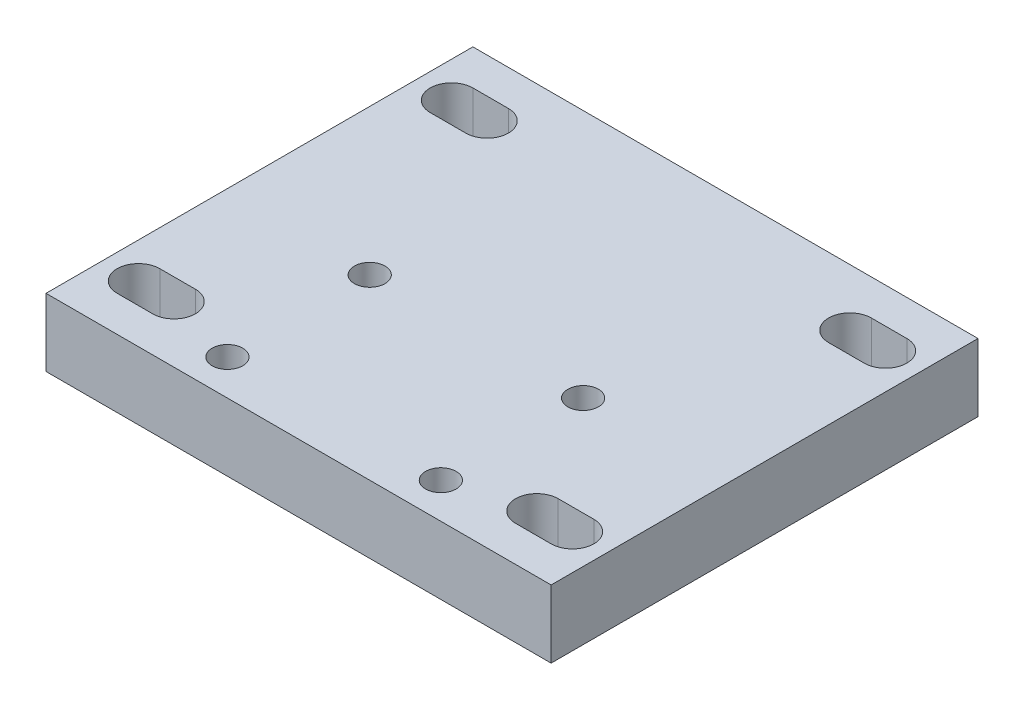
ISO-10303-21;
HEADER;
FILE_DESCRIPTION(('STEP AP214'),'2;1');
FILE_NAME('part.step','',(''),(''),'','','');
FILE_SCHEMA(('AUTOMOTIVE_DESIGN { 1 0 10303 214 1 1 1 1 }'));
ENDSEC;
DATA;
#1=APPLICATION_CONTEXT('core data for automotive mechanical design processes');
#2=APPLICATION_PROTOCOL_DEFINITION('international standard','automotive_design',2000,#1);
#3=PRODUCT_CONTEXT('',#1,'mechanical');
#4=PRODUCT('Part','Part','',(#3));
#5=PRODUCT_RELATED_PRODUCT_CATEGORY('part','',(#4));
#6=PRODUCT_DEFINITION_FORMATION('','',#4);
#7=PRODUCT_DEFINITION_CONTEXT('part definition',#1,'design');
#8=PRODUCT_DEFINITION('design','',#6,#7);
#9=PRODUCT_DEFINITION_SHAPE('','',#8);
#10=(LENGTH_UNIT() NAMED_UNIT(*) SI_UNIT(.MILLI.,.METRE.));
#11=(NAMED_UNIT(*) PLANE_ANGLE_UNIT() SI_UNIT($,.RADIAN.));
#12=(NAMED_UNIT(*) SI_UNIT($,.STERADIAN.) SOLID_ANGLE_UNIT());
#13=UNCERTAINTY_MEASURE_WITH_UNIT(LENGTH_MEASURE(1.E-05),#10,'distance_accuracy_value','');
#14=(GEOMETRIC_REPRESENTATION_CONTEXT(3) GLOBAL_UNCERTAINTY_ASSIGNED_CONTEXT((#13)) GLOBAL_UNIT_ASSIGNED_CONTEXT((#10,
#11,#12)) REPRESENTATION_CONTEXT('',''));
#15=CARTESIAN_POINT('',(0.,0.,0.));
#16=DIRECTION('',(0.,0.,1.));
#17=DIRECTION('',(1.,0.,0.));
#18=AXIS2_PLACEMENT_3D('',#15,#16,#17);
#19=CARTESIAN_POINT('',(0.,0.,60.));
#20=DIRECTION('',(1.,0.,0.));
#21=DIRECTION('',(0.,0.,-1.));
#22=AXIS2_PLACEMENT_3D('',#19,#20,#21);
#23=PLANE('',#22);
#24=DIRECTION('',(0.,-1.,0.));
#25=VECTOR('',#24,1.);
#26=CARTESIAN_POINT('',(0.,0.,0.));
#27=LINE('',#26,#25);
#28=CARTESIAN_POINT('',(0.,9.52,0.));
#29=VERTEX_POINT('',#28);
#30=CARTESIAN_POINT('',(0.,0.,0.));
#31=VERTEX_POINT('',#30);
#32=EDGE_CURVE('E320',#29,#31,#27,.T.);
#33=ORIENTED_EDGE('',*,*,#32,.T.);
#34=DIRECTION('',(0.,0.,-1.));
#35=VECTOR('',#34,1.);
#36=CARTESIAN_POINT('',(0.,0.,60.));
#37=LINE('',#36,#35);
#38=CARTESIAN_POINT('',(0.,0.,60.));
#39=VERTEX_POINT('',#38);
#40=EDGE_CURVE('E11',#39,#31,#37,.T.);
#41=ORIENTED_EDGE('',*,*,#40,.F.);
#42=DIRECTION('',(0.,-1.,0.));
#43=VECTOR('',#42,1.);
#44=CARTESIAN_POINT('',(0.,0.,60.));
#45=LINE('',#44,#43);
#46=CARTESIAN_POINT('',(0.,9.52,60.));
#47=VERTEX_POINT('',#46);
#48=EDGE_CURVE('E323',#47,#39,#45,.T.);
#49=ORIENTED_EDGE('',*,*,#48,.F.);
#50=DIRECTION('',(0.,0.,-1.));
#51=VECTOR('',#50,1.);
#52=CARTESIAN_POINT('',(0.,9.52,60.));
#53=LINE('',#52,#51);
#54=EDGE_CURVE('E333',#47,#29,#53,.T.);
#55=ORIENTED_EDGE('',*,*,#54,.T.);
#56=EDGE_LOOP('',(#33,#41,#49,#55));
#57=FACE_BOUND('',#56,.T.);
#58=ADVANCED_FACE('F38',(#57),#23,.F.);
#59=CARTESIAN_POINT('',(0.,0.,60.));
#60=DIRECTION('',(0.,1.,0.));
#61=DIRECTION('',(0.,0.,1.));
#62=AXIS2_PLACEMENT_3D('',#59,#60,#61);
#63=PLANE('',#62);
#64=CARTESIAN_POINT('',(50.5,0.,35.));
#65=DIRECTION('',(0.,-1.,0.));
#66=DIRECTION('',(0.,0.,-1.));
#67=AXIS2_PLACEMENT_3D('',#64,#65,#66);
#68=CIRCLE('',#67,3.75);
#69=CARTESIAN_POINT('',(50.5,0.,31.25));
#70=VERTEX_POINT('',#69);
#71=EDGE_CURVE('E809',#70,#70,#68,.T.);
#72=ORIENTED_EDGE('',*,*,#71,.F.);
#73=EDGE_LOOP('',(#72));
#74=FACE_BOUND('',#73,.T.);
#75=CARTESIAN_POINT('',(50.5,0.,55.));
#76=DIRECTION('',(0.,-1.,0.));
#77=DIRECTION('',(0.,0.,-1.));
#78=AXIS2_PLACEMENT_3D('',#75,#76,#77);
#79=CIRCLE('',#78,3.75);
#80=CARTESIAN_POINT('',(50.5,0.,51.25));
#81=VERTEX_POINT('',#80);
#82=EDGE_CURVE('E371',#81,#81,#79,.T.);
#83=ORIENTED_EDGE('',*,*,#82,.F.);
#84=EDGE_LOOP('',(#83));
#85=FACE_BOUND('',#84,.T.);
#86=CARTESIAN_POINT('',(20.5,0.,55.));
#87=DIRECTION('',(0.,-1.,0.));
#88=DIRECTION('',(0.,0.,-1.));
#89=AXIS2_PLACEMENT_3D('',#86,#87,#88);
#90=CIRCLE('',#89,3.75);
#91=CARTESIAN_POINT('',(20.5,0.,51.25));
#92=VERTEX_POINT('',#91);
#93=EDGE_CURVE('E358',#92,#92,#90,.T.);
#94=ORIENTED_EDGE('',*,*,#93,.F.);
#95=EDGE_LOOP('',(#94));
#96=FACE_BOUND('',#95,.T.);
#97=CARTESIAN_POINT('',(20.5,0.,35.));
#98=DIRECTION('',(0.,-1.,0.));
#99=DIRECTION('',(0.,0.,-1.));
#100=AXIS2_PLACEMENT_3D('',#97,#98,#99);
#101=CIRCLE('',#100,3.75);
#102=CARTESIAN_POINT('',(20.5,0.,31.25));
#103=VERTEX_POINT('',#102);
#104=EDGE_CURVE('E354',#103,#103,#101,.T.);
#105=ORIENTED_EDGE('',*,*,#104,.F.);
#106=EDGE_LOOP('',(#105));
#107=FACE_BOUND('',#106,.T.);
#108=DIRECTION('',(1.,0.,0.));
#109=VECTOR('',#108,1.);
#110=CARTESIAN_POINT('',(61.,0.,49.));
#111=LINE('',#110,#109);
#112=CARTESIAN_POINT('',(61.,0.,49.));
#113=VERTEX_POINT('',#112);
#114=CARTESIAN_POINT('',(66.,0.,49.));
#115=VERTEX_POINT('',#114);
#116=EDGE_CURVE('E220',#113,#115,#111,.T.);
#117=ORIENTED_EDGE('',*,*,#116,.F.);
#118=CARTESIAN_POINT('',(61.,0.,52.));
#119=DIRECTION('',(0.,1.,0.));
#120=DIRECTION('',(0.,0.,1.));
#121=AXIS2_PLACEMENT_3D('',#118,#119,#120);
#122=CIRCLE('',#121,3.);
#123=CARTESIAN_POINT('',(61.,0.,55.));
#124=VERTEX_POINT('',#123);
#125=EDGE_CURVE('E224',#124,#113,#122,.F.);
#126=ORIENTED_EDGE('',*,*,#125,.F.);
#127=DIRECTION('',(-1.,0.,0.));
#128=VECTOR('',#127,1.);
#129=CARTESIAN_POINT('',(61.,0.,55.));
#130=LINE('',#129,#128);
#131=CARTESIAN_POINT('',(66.,0.,55.));
#132=VERTEX_POINT('',#131);
#133=EDGE_CURVE('E241',#132,#124,#130,.T.);
#134=ORIENTED_EDGE('',*,*,#133,.F.);
#135=CARTESIAN_POINT('',(66.,0.,52.));
#136=DIRECTION('',(0.,1.,0.));
#137=DIRECTION('',(0.,0.,1.));
#138=AXIS2_PLACEMENT_3D('',#135,#136,#137);
#139=CIRCLE('',#138,3.);
#140=EDGE_CURVE('E54',#115,#132,#139,.F.);
#141=ORIENTED_EDGE('',*,*,#140,.F.);
#142=EDGE_LOOP('',(#117,#126,#134,#141));
#143=FACE_BOUND('',#142,.T.);
#144=DIRECTION('',(1.,0.,0.));
#145=VECTOR('',#144,1.);
#146=CARTESIAN_POINT('',(5.,0.,5.));
#147=LINE('',#146,#145);
#148=CARTESIAN_POINT('',(5.,0.,5.));
#149=VERTEX_POINT('',#148);
#150=CARTESIAN_POINT('',(10.,0.,5.));
#151=VERTEX_POINT('',#150);
#152=EDGE_CURVE('E252',#149,#151,#147,.T.);
#153=ORIENTED_EDGE('',*,*,#152,.F.);
#154=CARTESIAN_POINT('',(5.,0.,8.));
#155=DIRECTION('',(0.,1.,0.));
#156=DIRECTION('',(0.,0.,1.));
#157=AXIS2_PLACEMENT_3D('',#154,#155,#156);
#158=CIRCLE('',#157,3.);
#159=CARTESIAN_POINT('',(5.,0.,11.));
#160=VERTEX_POINT('',#159);
#161=EDGE_CURVE('E255',#160,#149,#158,.F.);
#162=ORIENTED_EDGE('',*,*,#161,.F.);
#163=DIRECTION('',(-1.,0.,0.));
#164=VECTOR('',#163,1.);
#165=CARTESIAN_POINT('',(5.,0.,11.));
#166=LINE('',#165,#164);
#167=CARTESIAN_POINT('',(10.,0.,11.));
#168=VERTEX_POINT('',#167);
#169=EDGE_CURVE('E221',#168,#160,#166,.T.);
#170=ORIENTED_EDGE('',*,*,#169,.F.);
#171=CARTESIAN_POINT('',(10.,0.,8.));
#172=DIRECTION('',(0.,1.,0.));
#173=DIRECTION('',(0.,0.,1.));
#174=AXIS2_PLACEMENT_3D('',#171,#172,#173);
#175=CIRCLE('',#174,3.);
#176=EDGE_CURVE('E62',#151,#168,#175,.F.);
#177=ORIENTED_EDGE('',*,*,#176,.F.);
#178=EDGE_LOOP('',(#153,#162,#170,#177));
#179=FACE_BOUND('',#178,.T.);
#180=DIRECTION('',(1.,0.,0.));
#181=VECTOR('',#180,1.);
#182=CARTESIAN_POINT('',(5.,0.,49.));
#183=LINE('',#182,#181);
#184=CARTESIAN_POINT('',(5.,0.,49.));
#185=VERTEX_POINT('',#184);
#186=CARTESIAN_POINT('',(10.,0.,49.));
#187=VERTEX_POINT('',#186);
#188=EDGE_CURVE('E201',#185,#187,#183,.T.);
#189=ORIENTED_EDGE('',*,*,#188,.F.);
#190=CARTESIAN_POINT('',(5.,0.,52.));
#191=DIRECTION('',(0.,1.,0.));
#192=DIRECTION('',(0.,0.,1.));
#193=AXIS2_PLACEMENT_3D('',#190,#191,#192);
#194=CIRCLE('',#193,3.);
#195=CARTESIAN_POINT('',(5.,0.,55.));
#196=VERTEX_POINT('',#195);
#197=EDGE_CURVE('E180',#196,#185,#194,.F.);
#198=ORIENTED_EDGE('',*,*,#197,.F.);
#199=DIRECTION('',(-1.,0.,0.));
#200=VECTOR('',#199,1.);
#201=CARTESIAN_POINT('',(5.,0.,55.));
#202=LINE('',#201,#200);
#203=CARTESIAN_POINT('',(10.,0.,55.));
#204=VERTEX_POINT('',#203);
#205=EDGE_CURVE('E192',#204,#196,#202,.T.);
#206=ORIENTED_EDGE('',*,*,#205,.F.);
#207=CARTESIAN_POINT('',(10.,0.,52.));
#208=DIRECTION('',(0.,1.,0.));
#209=DIRECTION('',(0.,0.,1.));
#210=AXIS2_PLACEMENT_3D('',#207,#208,#209);
#211=CIRCLE('',#210,3.);
#212=EDGE_CURVE('E205',#187,#204,#211,.F.);
#213=ORIENTED_EDGE('',*,*,#212,.F.);
#214=EDGE_LOOP('',(#189,#198,#206,#213));
#215=FACE_BOUND('',#214,.T.);
#216=DIRECTION('',(1.,0.,0.));
#217=VECTOR('',#216,1.);
#218=CARTESIAN_POINT('',(61.,0.,5.));
#219=LINE('',#218,#217);
#220=CARTESIAN_POINT('',(61.,0.,5.));
#221=VERTEX_POINT('',#220);
#222=CARTESIAN_POINT('',(66.,0.,5.));
#223=VERTEX_POINT('',#222);
#224=EDGE_CURVE('E281',#221,#223,#219,.T.);
#225=ORIENTED_EDGE('',*,*,#224,.F.);
#226=CARTESIAN_POINT('',(61.,0.,8.));
#227=DIRECTION('',(0.,1.,0.));
#228=DIRECTION('',(0.,0.,1.));
#229=AXIS2_PLACEMENT_3D('',#226,#227,#228);
#230=CIRCLE('',#229,3.);
#231=CARTESIAN_POINT('',(61.,0.,11.));
#232=VERTEX_POINT('',#231);
#233=EDGE_CURVE('E284',#232,#221,#230,.F.);
#234=ORIENTED_EDGE('',*,*,#233,.F.);
#235=DIRECTION('',(-1.,0.,0.));
#236=VECTOR('',#235,1.);
#237=CARTESIAN_POINT('',(61.,0.,11.));
#238=LINE('',#237,#236);
#239=CARTESIAN_POINT('',(66.,0.,11.));
#240=VERTEX_POINT('',#239);
#241=EDGE_CURVE('E301',#240,#232,#238,.T.);
#242=ORIENTED_EDGE('',*,*,#241,.F.);
#243=CARTESIAN_POINT('',(66.,0.,8.));
#244=DIRECTION('',(0.,1.,0.));
#245=DIRECTION('',(0.,0.,1.));
#246=AXIS2_PLACEMENT_3D('',#243,#244,#245);
#247=CIRCLE('',#246,3.);
#248=EDGE_CURVE('E250',#223,#240,#247,.F.);
#249=ORIENTED_EDGE('',*,*,#248,.F.);
#250=EDGE_LOOP('',(#225,#234,#242,#249));
#251=FACE_BOUND('',#250,.T.);
#252=DIRECTION('',(1.,0.,0.));
#253=VECTOR('',#252,1.);
#254=CARTESIAN_POINT('',(0.,0.,0.));
#255=LINE('',#254,#253);
#256=CARTESIAN_POINT('',(71.,0.,0.));
#257=VERTEX_POINT('',#256);
#258=EDGE_CURVE('E336',#31,#257,#255,.T.);
#259=ORIENTED_EDGE('',*,*,#258,.T.);
#260=DIRECTION('',(0.,0.,-1.));
#261=VECTOR('',#260,1.);
#262=CARTESIAN_POINT('',(71.,0.,60.));
#263=LINE('',#262,#261);
#264=CARTESIAN_POINT('',(71.,0.,60.));
#265=VERTEX_POINT('',#264);
#266=EDGE_CURVE('E46',#265,#257,#263,.T.);
#267=ORIENTED_EDGE('',*,*,#266,.F.);
#268=DIRECTION('',(1.,0.,0.));
#269=VECTOR('',#268,1.);
#270=CARTESIAN_POINT('',(0.,0.,60.));
#271=LINE('',#270,#269);
#272=EDGE_CURVE('E326',#39,#265,#271,.T.);
#273=ORIENTED_EDGE('',*,*,#272,.F.);
#274=ORIENTED_EDGE('',*,*,#40,.T.);
#275=EDGE_LOOP('',(#259,#267,#273,#274));
#276=FACE_BOUND('',#275,.T.);
#277=ADVANCED_FACE('F198',(#74,#85,#96,#107,#143,#179,#215,#251,#276),#63,.F.);
#278=CARTESIAN_POINT('',(71.,0.,60.));
#279=DIRECTION('',(-1.,0.,0.));
#280=DIRECTION('',(0.,0.,1.));
#281=AXIS2_PLACEMENT_3D('',#278,#279,#280);
#282=PLANE('',#281);
#283=DIRECTION('',(0.,1.,0.));
#284=VECTOR('',#283,1.);
#285=CARTESIAN_POINT('',(71.,0.,0.));
#286=LINE('',#285,#284);
#287=CARTESIAN_POINT('',(71.,9.52,0.));
#288=VERTEX_POINT('',#287);
#289=EDGE_CURVE('E338',#257,#288,#286,.T.);
#290=ORIENTED_EDGE('',*,*,#289,.T.);
#291=DIRECTION('',(0.,0.,-1.));
#292=VECTOR('',#291,1.);
#293=CARTESIAN_POINT('',(71.,9.52,60.));
#294=LINE('',#293,#292);
#295=CARTESIAN_POINT('',(71.,9.52,60.));
#296=VERTEX_POINT('',#295);
#297=EDGE_CURVE('E343',#296,#288,#294,.T.);
#298=ORIENTED_EDGE('',*,*,#297,.F.);
#299=DIRECTION('',(0.,1.,0.));
#300=VECTOR('',#299,1.);
#301=CARTESIAN_POINT('',(71.,0.,60.));
#302=LINE('',#301,#300);
#303=EDGE_CURVE('E329',#265,#296,#302,.T.);
#304=ORIENTED_EDGE('',*,*,#303,.F.);
#305=ORIENTED_EDGE('',*,*,#266,.T.);
#306=EDGE_LOOP('',(#290,#298,#304,#305));
#307=FACE_BOUND('',#306,.T.);
#308=ADVANCED_FACE('F396',(#307),#282,.F.);
#309=CARTESIAN_POINT('',(0.,9.52,60.));
#310=DIRECTION('',(0.,-1.,0.));
#311=DIRECTION('',(0.,0.,-1.));
#312=AXIS2_PLACEMENT_3D('',#309,#310,#311);
#313=PLANE('',#312);
#314=CARTESIAN_POINT('',(50.5,9.52,35.));
#315=DIRECTION('',(0.,-1.,0.));
#316=DIRECTION('',(0.,0.,-1.));
#317=AXIS2_PLACEMENT_3D('',#314,#315,#316);
#318=CIRCLE('',#317,2.15);
#319=CARTESIAN_POINT('',(50.5,9.52,32.85));
#320=VERTEX_POINT('',#319);
#321=EDGE_CURVE('E41',#320,#320,#318,.T.);
#322=ORIENTED_EDGE('',*,*,#321,.T.);
#323=EDGE_LOOP('',(#322));
#324=FACE_BOUND('',#323,.T.);
#325=CARTESIAN_POINT('',(50.5,9.52,55.));
#326=DIRECTION('',(0.,-1.,0.));
#327=DIRECTION('',(0.,0.,-1.));
#328=AXIS2_PLACEMENT_3D('',#325,#326,#327);
#329=CIRCLE('',#328,2.15);
#330=CARTESIAN_POINT('',(50.5,9.52,52.85));
#331=VERTEX_POINT('',#330);
#332=EDGE_CURVE('E356',#331,#331,#329,.T.);
#333=ORIENTED_EDGE('',*,*,#332,.T.);
#334=EDGE_LOOP('',(#333));
#335=FACE_BOUND('',#334,.T.);
#336=CARTESIAN_POINT('',(20.5,9.52,55.));
#337=DIRECTION('',(0.,-1.,0.));
#338=DIRECTION('',(0.,0.,-1.));
#339=AXIS2_PLACEMENT_3D('',#336,#337,#338);
#340=CIRCLE('',#339,2.15);
#341=CARTESIAN_POINT('',(20.5,9.52,52.85));
#342=VERTEX_POINT('',#341);
#343=EDGE_CURVE('E352',#342,#342,#340,.T.);
#344=ORIENTED_EDGE('',*,*,#343,.T.);
#345=EDGE_LOOP('',(#344));
#346=FACE_BOUND('',#345,.T.);
#347=CARTESIAN_POINT('',(20.5,9.52,35.));
#348=DIRECTION('',(0.,-1.,0.));
#349=DIRECTION('',(0.,0.,-1.));
#350=AXIS2_PLACEMENT_3D('',#347,#348,#349);
#351=CIRCLE('',#350,2.15);
#352=CARTESIAN_POINT('',(20.5,9.52,32.85));
#353=VERTEX_POINT('',#352);
#354=EDGE_CURVE('E348',#353,#353,#351,.T.);
#355=ORIENTED_EDGE('',*,*,#354,.T.);
#356=EDGE_LOOP('',(#355));
#357=FACE_BOUND('',#356,.T.);
#358=DIRECTION('',(1.,0.,0.));
#359=VECTOR('',#358,1.);
#360=CARTESIAN_POINT('',(61.,9.52,55.));
#361=LINE('',#360,#359);
#362=CARTESIAN_POINT('',(61.,9.52,55.));
#363=VERTEX_POINT('',#362);
#364=CARTESIAN_POINT('',(66.,9.52,55.));
#365=VERTEX_POINT('',#364);
#366=EDGE_CURVE('E229',#363,#365,#361,.T.);
#367=ORIENTED_EDGE('',*,*,#366,.F.);
#368=CARTESIAN_POINT('',(61.,9.52,52.));
#369=DIRECTION('',(0.,1.,0.));
#370=DIRECTION('',(0.,0.,1.));
#371=AXIS2_PLACEMENT_3D('',#368,#369,#370);
#372=CIRCLE('',#371,3.);
#373=CARTESIAN_POINT('',(61.,9.52,49.));
#374=VERTEX_POINT('',#373);
#375=EDGE_CURVE('E227',#374,#363,#372,.T.);
#376=ORIENTED_EDGE('',*,*,#375,.F.);
#377=DIRECTION('',(-1.,0.,0.));
#378=VECTOR('',#377,1.);
#379=CARTESIAN_POINT('',(61.,9.52,49.));
#380=LINE('',#379,#378);
#381=CARTESIAN_POINT('',(66.,9.52,49.));
#382=VERTEX_POINT('',#381);
#383=EDGE_CURVE('E235',#382,#374,#380,.T.);
#384=ORIENTED_EDGE('',*,*,#383,.F.);
#385=CARTESIAN_POINT('',(66.,9.52,52.));
#386=DIRECTION('',(0.,1.,0.));
#387=DIRECTION('',(0.,0.,1.));
#388=AXIS2_PLACEMENT_3D('',#385,#386,#387);
#389=CIRCLE('',#388,3.);
#390=EDGE_CURVE('E232',#365,#382,#389,.T.);
#391=ORIENTED_EDGE('',*,*,#390,.F.);
#392=EDGE_LOOP('',(#367,#376,#384,#391));
#393=FACE_BOUND('',#392,.T.);
#394=DIRECTION('',(1.,0.,0.));
#395=VECTOR('',#394,1.);
#396=CARTESIAN_POINT('',(5.,9.52,11.));
#397=LINE('',#396,#395);
#398=CARTESIAN_POINT('',(5.,9.52,11.));
#399=VERTEX_POINT('',#398);
#400=CARTESIAN_POINT('',(10.,9.52,11.));
#401=VERTEX_POINT('',#400);
#402=EDGE_CURVE('E260',#399,#401,#397,.T.);
#403=ORIENTED_EDGE('',*,*,#402,.F.);
#404=CARTESIAN_POINT('',(5.,9.52,8.));
#405=DIRECTION('',(0.,1.,0.));
#406=DIRECTION('',(0.,0.,1.));
#407=AXIS2_PLACEMENT_3D('',#404,#405,#406);
#408=CIRCLE('',#407,3.);
#409=CARTESIAN_POINT('',(5.,9.52,5.));
#410=VERTEX_POINT('',#409);
#411=EDGE_CURVE('E258',#410,#399,#408,.T.);
#412=ORIENTED_EDGE('',*,*,#411,.F.);
#413=DIRECTION('',(-1.,0.,0.));
#414=VECTOR('',#413,1.);
#415=CARTESIAN_POINT('',(5.,9.52,5.));
#416=LINE('',#415,#414);
#417=CARTESIAN_POINT('',(10.,9.52,5.));
#418=VERTEX_POINT('',#417);
#419=EDGE_CURVE('E266',#418,#410,#416,.T.);
#420=ORIENTED_EDGE('',*,*,#419,.F.);
#421=CARTESIAN_POINT('',(10.,9.52,8.));
#422=DIRECTION('',(0.,1.,0.));
#423=DIRECTION('',(0.,0.,1.));
#424=AXIS2_PLACEMENT_3D('',#421,#422,#423);
#425=CIRCLE('',#424,3.);
#426=EDGE_CURVE('E263',#401,#418,#425,.T.);
#427=ORIENTED_EDGE('',*,*,#426,.F.);
#428=EDGE_LOOP('',(#403,#412,#420,#427));
#429=FACE_BOUND('',#428,.T.);
#430=DIRECTION('',(1.,0.,0.));
#431=VECTOR('',#430,1.);
#432=CARTESIAN_POINT('',(5.,9.52,55.));
#433=LINE('',#432,#431);
#434=CARTESIAN_POINT('',(5.,9.52,55.));
#435=VERTEX_POINT('',#434);
#436=CARTESIAN_POINT('',(10.,9.52,55.));
#437=VERTEX_POINT('',#436);
#438=EDGE_CURVE('E203',#435,#437,#433,.T.);
#439=ORIENTED_EDGE('',*,*,#438,.F.);
#440=CARTESIAN_POINT('',(5.,9.52,52.));
#441=DIRECTION('',(0.,1.,0.));
#442=DIRECTION('',(0.,0.,1.));
#443=AXIS2_PLACEMENT_3D('',#440,#441,#442);
#444=CIRCLE('',#443,3.);
#445=CARTESIAN_POINT('',(5.,9.52,49.));
#446=VERTEX_POINT('',#445);
#447=EDGE_CURVE('E183',#446,#435,#444,.T.);
#448=ORIENTED_EDGE('',*,*,#447,.F.);
#449=DIRECTION('',(-1.,0.,0.));
#450=VECTOR('',#449,1.);
#451=CARTESIAN_POINT('',(5.,9.52,49.));
#452=LINE('',#451,#450);
#453=CARTESIAN_POINT('',(10.,9.52,49.));
#454=VERTEX_POINT('',#453);
#455=EDGE_CURVE('E188',#454,#446,#452,.T.);
#456=ORIENTED_EDGE('',*,*,#455,.F.);
#457=CARTESIAN_POINT('',(10.,9.52,52.));
#458=DIRECTION('',(0.,1.,0.));
#459=DIRECTION('',(0.,0.,1.));
#460=AXIS2_PLACEMENT_3D('',#457,#458,#459);
#461=CIRCLE('',#460,3.);
#462=EDGE_CURVE('E210',#437,#454,#461,.T.);
#463=ORIENTED_EDGE('',*,*,#462,.F.);
#464=EDGE_LOOP('',(#439,#448,#456,#463));
#465=FACE_BOUND('',#464,.T.);
#466=DIRECTION('',(1.,0.,0.));
#467=VECTOR('',#466,1.);
#468=CARTESIAN_POINT('',(61.,9.52,11.));
#469=LINE('',#468,#467);
#470=CARTESIAN_POINT('',(61.,9.52,11.));
#471=VERTEX_POINT('',#470);
#472=CARTESIAN_POINT('',(66.,9.52,11.));
#473=VERTEX_POINT('',#472);
#474=EDGE_CURVE('E289',#471,#473,#469,.T.);
#475=ORIENTED_EDGE('',*,*,#474,.F.);
#476=CARTESIAN_POINT('',(61.,9.52,8.));
#477=DIRECTION('',(0.,1.,0.));
#478=DIRECTION('',(0.,0.,1.));
#479=AXIS2_PLACEMENT_3D('',#476,#477,#478);
#480=CIRCLE('',#479,3.);
#481=CARTESIAN_POINT('',(61.,9.52,5.));
#482=VERTEX_POINT('',#481);
#483=EDGE_CURVE('E287',#482,#471,#480,.T.);
#484=ORIENTED_EDGE('',*,*,#483,.F.);
#485=DIRECTION('',(-1.,0.,0.));
#486=VECTOR('',#485,1.);
#487=CARTESIAN_POINT('',(61.,9.52,5.));
#488=LINE('',#487,#486);
#489=CARTESIAN_POINT('',(66.,9.52,5.));
#490=VERTEX_POINT('',#489);
#491=EDGE_CURVE('E295',#490,#482,#488,.T.);
#492=ORIENTED_EDGE('',*,*,#491,.F.);
#493=CARTESIAN_POINT('',(66.,9.52,8.));
#494=DIRECTION('',(0.,1.,0.));
#495=DIRECTION('',(0.,0.,1.));
#496=AXIS2_PLACEMENT_3D('',#493,#494,#495);
#497=CIRCLE('',#496,3.);
#498=EDGE_CURVE('E292',#473,#490,#497,.T.);
#499=ORIENTED_EDGE('',*,*,#498,.F.);
#500=EDGE_LOOP('',(#475,#484,#492,#499));
#501=FACE_BOUND('',#500,.T.);
#502=DIRECTION('',(-1.,0.,0.));
#503=VECTOR('',#502,1.);
#504=CARTESIAN_POINT('',(0.,9.52,0.));
#505=LINE('',#504,#503);
#506=EDGE_CURVE('E327',#288,#29,#505,.T.);
#507=ORIENTED_EDGE('',*,*,#506,.T.);
#508=ORIENTED_EDGE('',*,*,#54,.F.);
#509=DIRECTION('',(-1.,0.,0.));
#510=VECTOR('',#509,1.);
#511=CARTESIAN_POINT('',(0.,9.52,60.));
#512=LINE('',#511,#510);
#513=EDGE_CURVE('E331',#296,#47,#512,.T.);
#514=ORIENTED_EDGE('',*,*,#513,.F.);
#515=ORIENTED_EDGE('',*,*,#297,.T.);
#516=EDGE_LOOP('',(#507,#508,#514,#515));
#517=FACE_BOUND('',#516,.T.);
#518=ADVANCED_FACE('F392',(#324,#335,#346,#357,#393,#429,#465,#501,#517),#313,.F.);
#519=CARTESIAN_POINT('',(0.,0.,60.));
#520=DIRECTION('',(0.,0.,-1.));
#521=DIRECTION('',(-1.,0.,0.));
#522=AXIS2_PLACEMENT_3D('',#519,#520,#521);
#523=PLANE('',#522);
#524=ORIENTED_EDGE('',*,*,#48,.T.);
#525=ORIENTED_EDGE('',*,*,#272,.T.);
#526=ORIENTED_EDGE('',*,*,#303,.T.);
#527=ORIENTED_EDGE('',*,*,#513,.T.);
#528=EDGE_LOOP('',(#524,#525,#526,#527));
#529=FACE_BOUND('',#528,.T.);
#530=ADVANCED_FACE('F395',(#529),#523,.F.);
#531=CARTESIAN_POINT('',(0.,0.,0.));
#532=DIRECTION('',(0.,0.,-1.));
#533=DIRECTION('',(-1.,0.,0.));
#534=AXIS2_PLACEMENT_3D('',#531,#532,#533);
#535=PLANE('',#534);
#536=CARTESIAN_POINT('',(18.,4.73999999999998,0.));
#537=DIRECTION('',(0.,0.,-1.));
#538=DIRECTION('',(-1.,0.,0.));
#539=AXIS2_PLACEMENT_3D('',#536,#537,#538);
#540=CIRCLE('',#539,2.37999999999999);
#541=CARTESIAN_POINT('',(15.62,4.73999999999998,0.));
#542=VERTEX_POINT('',#541);
#543=EDGE_CURVE('E310',#542,#542,#540,.T.);
#544=ORIENTED_EDGE('',*,*,#543,.F.);
#545=EDGE_LOOP('',(#544));
#546=FACE_BOUND('',#545,.T.);
#547=CARTESIAN_POINT('',(54.,4.73999999999998,0.));
#548=DIRECTION('',(0.,0.,-1.));
#549=DIRECTION('',(-1.,0.,0.));
#550=AXIS2_PLACEMENT_3D('',#547,#548,#549);
#551=CIRCLE('',#550,2.37999999999999);
#552=CARTESIAN_POINT('',(51.62,4.73999999999998,0.));
#553=VERTEX_POINT('',#552);
#554=EDGE_CURVE('E314',#553,#553,#551,.T.);
#555=ORIENTED_EDGE('',*,*,#554,.F.);
#556=EDGE_LOOP('',(#555));
#557=FACE_BOUND('',#556,.T.);
#558=ORIENTED_EDGE('',*,*,#32,.F.);
#559=ORIENTED_EDGE('',*,*,#506,.F.);
#560=ORIENTED_EDGE('',*,*,#289,.F.);
#561=ORIENTED_EDGE('',*,*,#258,.F.);
#562=EDGE_LOOP('',(#558,#559,#560,#561));
#563=FACE_BOUND('',#562,.T.);
#564=ADVANCED_FACE('F413',(#546,#557,#563),#535,.T.);
#565=CARTESIAN_POINT('',(54.,4.73999999999998,15.));
#566=DIRECTION('',(0.,0.,-1.));
#567=DIRECTION('',(-1.,0.,0.));
#568=AXIS2_PLACEMENT_3D('',#565,#566,#567);
#569=CYLINDRICAL_SURFACE('',#568,2.37999999999999);
#570=CARTESIAN_POINT('',(54.,4.73999999999998,15.));
#571=DIRECTION('',(0.,0.,-1.));
#572=DIRECTION('',(-1.,0.,0.));
#573=AXIS2_PLACEMENT_3D('',#570,#571,#572);
#574=CIRCLE('',#573,2.37999999999999);
#575=CARTESIAN_POINT('',(51.62,4.73999999999998,15.));
#576=VERTEX_POINT('',#575);
#577=EDGE_CURVE('E317',#576,#576,#574,.T.);
#578=ORIENTED_EDGE('',*,*,#577,.F.);
#579=EDGE_LOOP('',(#578));
#580=FACE_BOUND('',#579,.T.);
#581=ORIENTED_EDGE('',*,*,#554,.T.);
#582=EDGE_LOOP('',(#581));
#583=FACE_BOUND('',#582,.T.);
#584=ADVANCED_FACE('F636',(#580,#583),#569,.F.);
#585=CARTESIAN_POINT('',(54.,4.73999999999998,15.));
#586=DIRECTION('',(0.,0.,-1.));
#587=DIRECTION('',(-1.,0.,0.));
#588=AXIS2_PLACEMENT_3D('',#585,#586,#587);
#589=PLANE('',#588);
#590=ORIENTED_EDGE('',*,*,#577,.T.);
#591=EDGE_LOOP('',(#590));
#592=FACE_BOUND('',#591,.T.);
#593=ADVANCED_FACE('F632',(#592),#589,.T.);
#594=CARTESIAN_POINT('',(18.,4.73999999999998,15.));
#595=DIRECTION('',(0.,0.,-1.));
#596=DIRECTION('',(-1.,0.,0.));
#597=AXIS2_PLACEMENT_3D('',#594,#595,#596);
#598=CYLINDRICAL_SURFACE('',#597,2.37999999999999);
#599=CARTESIAN_POINT('',(18.,4.73999999999998,15.));
#600=DIRECTION('',(0.,0.,-1.));
#601=DIRECTION('',(-1.,0.,0.));
#602=AXIS2_PLACEMENT_3D('',#599,#600,#601);
#603=CIRCLE('',#602,2.37999999999999);
#604=CARTESIAN_POINT('',(15.62,4.73999999999998,15.));
#605=VERTEX_POINT('',#604);
#606=EDGE_CURVE('E311',#605,#605,#603,.T.);
#607=ORIENTED_EDGE('',*,*,#606,.F.);
#608=EDGE_LOOP('',(#607));
#609=FACE_BOUND('',#608,.T.);
#610=ORIENTED_EDGE('',*,*,#543,.T.);
#611=EDGE_LOOP('',(#610));
#612=FACE_BOUND('',#611,.T.);
#613=ADVANCED_FACE('F628',(#609,#612),#598,.F.);
#614=CARTESIAN_POINT('',(18.,4.73999999999998,15.));
#615=DIRECTION('',(0.,0.,-1.));
#616=DIRECTION('',(-1.,0.,0.));
#617=AXIS2_PLACEMENT_3D('',#614,#615,#616);
#618=PLANE('',#617);
#619=ORIENTED_EDGE('',*,*,#606,.T.);
#620=EDGE_LOOP('',(#619));
#621=FACE_BOUND('',#620,.T.);
#622=ADVANCED_FACE('F624',(#621),#618,.T.);
#623=CARTESIAN_POINT('',(61.,-0.000999999999999265,8.));
#624=DIRECTION('',(0.,1.,0.));
#625=DIRECTION('',(0.,0.,1.));
#626=AXIS2_PLACEMENT_3D('',#623,#624,#625);
#627=CYLINDRICAL_SURFACE('',#626,3.);
#628=ORIENTED_EDGE('',*,*,#233,.T.);
#629=DIRECTION('',(0.,1.,0.));
#630=VECTOR('',#629,1.);
#631=CARTESIAN_POINT('',(61.,-0.000999999999999265,5.));
#632=LINE('',#631,#630);
#633=EDGE_CURVE('E299',#221,#482,#632,.T.);
#634=ORIENTED_EDGE('',*,*,#633,.T.);
#635=ORIENTED_EDGE('',*,*,#483,.T.);
#636=DIRECTION('',(0.,1.,0.));
#637=VECTOR('',#636,1.);
#638=CARTESIAN_POINT('',(61.,-0.000999999999999265,11.));
#639=LINE('',#638,#637);
#640=EDGE_CURVE('E298',#232,#471,#639,.T.);
#641=ORIENTED_EDGE('',*,*,#640,.F.);
#642=EDGE_LOOP('',(#628,#634,#635,#641));
#643=FACE_BOUND('',#642,.T.);
#644=ADVANCED_FACE('F614',(#643),#627,.F.);
#645=CARTESIAN_POINT('',(61.,-0.000999999999999265,5.));
#646=DIRECTION('',(0.,0.,-1.));
#647=DIRECTION('',(-1.,0.,0.));
#648=AXIS2_PLACEMENT_3D('',#645,#646,#647);
#649=PLANE('',#648);
#650=ORIENTED_EDGE('',*,*,#224,.T.);
#651=DIRECTION('',(0.,1.,0.));
#652=VECTOR('',#651,1.);
#653=CARTESIAN_POINT('',(66.,-0.000999999999999265,5.));
#654=LINE('',#653,#652);
#655=EDGE_CURVE('E302',#223,#490,#654,.T.);
#656=ORIENTED_EDGE('',*,*,#655,.T.);
#657=ORIENTED_EDGE('',*,*,#491,.T.);
#658=ORIENTED_EDGE('',*,*,#633,.F.);
#659=EDGE_LOOP('',(#650,#656,#657,#658));
#660=FACE_BOUND('',#659,.T.);
#661=ADVANCED_FACE('F610',(#660),#649,.F.);
#662=CARTESIAN_POINT('',(66.,-0.000999999999999265,8.));
#663=DIRECTION('',(0.,1.,0.));
#664=DIRECTION('',(0.,0.,1.));
#665=AXIS2_PLACEMENT_3D('',#662,#663,#664);
#666=CYLINDRICAL_SURFACE('',#665,3.);
#667=ORIENTED_EDGE('',*,*,#248,.T.);
#668=DIRECTION('',(0.,1.,0.));
#669=VECTOR('',#668,1.);
#670=CARTESIAN_POINT('',(66.,-0.000999999999999265,11.));
#671=LINE('',#670,#669);
#672=EDGE_CURVE('E304',#240,#473,#671,.T.);
#673=ORIENTED_EDGE('',*,*,#672,.T.);
#674=ORIENTED_EDGE('',*,*,#498,.T.);
#675=ORIENTED_EDGE('',*,*,#655,.F.);
#676=EDGE_LOOP('',(#667,#673,#674,#675));
#677=FACE_BOUND('',#676,.T.);
#678=ADVANCED_FACE('F613',(#677),#666,.F.);
#679=CARTESIAN_POINT('',(61.,-0.000999999999999265,11.));
#680=DIRECTION('',(0.,0.,1.));
#681=DIRECTION('',(1.,0.,0.));
#682=AXIS2_PLACEMENT_3D('',#679,#680,#681);
#683=PLANE('',#682);
#684=ORIENTED_EDGE('',*,*,#241,.T.);
#685=ORIENTED_EDGE('',*,*,#640,.T.);
#686=ORIENTED_EDGE('',*,*,#474,.T.);
#687=ORIENTED_EDGE('',*,*,#672,.F.);
#688=EDGE_LOOP('',(#684,#685,#686,#687));
#689=FACE_BOUND('',#688,.T.);
#690=ADVANCED_FACE('F582',(#689),#683,.F.);
#691=CARTESIAN_POINT('',(5.,-0.000999999999999265,52.));
#692=DIRECTION('',(0.,1.,0.));
#693=DIRECTION('',(0.,0.,1.));
#694=AXIS2_PLACEMENT_3D('',#691,#692,#693);
#695=CYLINDRICAL_SURFACE('',#694,3.);
#696=ORIENTED_EDGE('',*,*,#197,.T.);
#697=DIRECTION('',(0.,1.,0.));
#698=VECTOR('',#697,1.);
#699=CARTESIAN_POINT('',(5.,-0.000999999999999265,49.));
#700=LINE('',#699,#698);
#701=EDGE_CURVE('E196',#185,#446,#700,.T.);
#702=ORIENTED_EDGE('',*,*,#701,.T.);
#703=ORIENTED_EDGE('',*,*,#447,.T.);
#704=DIRECTION('',(0.,1.,0.));
#705=VECTOR('',#704,1.);
#706=CARTESIAN_POINT('',(5.,-0.000999999999999265,55.));
#707=LINE('',#706,#705);
#708=EDGE_CURVE('E176',#196,#435,#707,.T.);
#709=ORIENTED_EDGE('',*,*,#708,.F.);
#710=EDGE_LOOP('',(#696,#702,#703,#709));
#711=FACE_BOUND('',#710,.T.);
#712=ADVANCED_FACE('F178',(#711),#695,.F.);
#713=CARTESIAN_POINT('',(5.,-0.000999999999999265,49.));
#714=DIRECTION('',(0.,0.,-1.));
#715=DIRECTION('',(-1.,0.,0.));
#716=AXIS2_PLACEMENT_3D('',#713,#714,#715);
#717=PLANE('',#716);
#718=ORIENTED_EDGE('',*,*,#188,.T.);
#719=DIRECTION('',(0.,1.,0.));
#720=VECTOR('',#719,1.);
#721=CARTESIAN_POINT('',(10.,-0.000999999999999265,49.));
#722=LINE('',#721,#720);
#723=EDGE_CURVE('E216',#187,#454,#722,.T.);
#724=ORIENTED_EDGE('',*,*,#723,.T.);
#725=ORIENTED_EDGE('',*,*,#455,.T.);
#726=ORIENTED_EDGE('',*,*,#701,.F.);
#727=EDGE_LOOP('',(#718,#724,#725,#726));
#728=FACE_BOUND('',#727,.T.);
#729=ADVANCED_FACE('F390',(#728),#717,.F.);
#730=CARTESIAN_POINT('',(10.,-0.000999999999999265,52.));
#731=DIRECTION('',(0.,1.,0.));
#732=DIRECTION('',(0.,0.,1.));
#733=AXIS2_PLACEMENT_3D('',#730,#731,#732);
#734=CYLINDRICAL_SURFACE('',#733,3.);
#735=ORIENTED_EDGE('',*,*,#212,.T.);
#736=DIRECTION('',(0.,1.,0.));
#737=VECTOR('',#736,1.);
#738=CARTESIAN_POINT('',(10.,-0.000999999999999265,55.));
#739=LINE('',#738,#737);
#740=EDGE_CURVE('E187',#204,#437,#739,.T.);
#741=ORIENTED_EDGE('',*,*,#740,.T.);
#742=ORIENTED_EDGE('',*,*,#462,.T.);
#743=ORIENTED_EDGE('',*,*,#723,.F.);
#744=EDGE_LOOP('',(#735,#741,#742,#743));
#745=FACE_BOUND('',#744,.T.);
#746=ADVANCED_FACE('F386',(#745),#734,.F.);
#747=CARTESIAN_POINT('',(5.,-0.000999999999999265,55.));
#748=DIRECTION('',(0.,0.,1.));
#749=DIRECTION('',(1.,0.,0.));
#750=AXIS2_PLACEMENT_3D('',#747,#748,#749);
#751=PLANE('',#750);
#752=ORIENTED_EDGE('',*,*,#205,.T.);
#753=ORIENTED_EDGE('',*,*,#708,.T.);
#754=ORIENTED_EDGE('',*,*,#438,.T.);
#755=ORIENTED_EDGE('',*,*,#740,.F.);
#756=EDGE_LOOP('',(#752,#753,#754,#755));
#757=FACE_BOUND('',#756,.T.);
#758=ADVANCED_FACE('F193',(#757),#751,.F.);
#759=CARTESIAN_POINT('',(5.,-0.000999999999999265,8.));
#760=DIRECTION('',(0.,1.,0.));
#761=DIRECTION('',(0.,0.,1.));
#762=AXIS2_PLACEMENT_3D('',#759,#760,#761);
#763=CYLINDRICAL_SURFACE('',#762,3.);
#764=ORIENTED_EDGE('',*,*,#161,.T.);
#765=DIRECTION('',(0.,1.,0.));
#766=VECTOR('',#765,1.);
#767=CARTESIAN_POINT('',(5.,-0.000999999999999265,5.));
#768=LINE('',#767,#766);
#769=EDGE_CURVE('E270',#149,#410,#768,.T.);
#770=ORIENTED_EDGE('',*,*,#769,.T.);
#771=ORIENTED_EDGE('',*,*,#411,.T.);
#772=DIRECTION('',(0.,1.,0.));
#773=VECTOR('',#772,1.);
#774=CARTESIAN_POINT('',(5.,-0.000999999999999265,11.));
#775=LINE('',#774,#773);
#776=EDGE_CURVE('E269',#160,#399,#775,.T.);
#777=ORIENTED_EDGE('',*,*,#776,.F.);
#778=EDGE_LOOP('',(#764,#770,#771,#777));
#779=FACE_BOUND('',#778,.T.);
#780=ADVANCED_FACE('F579',(#779),#763,.F.);
#781=CARTESIAN_POINT('',(5.,-0.000999999999999265,5.));
#782=DIRECTION('',(0.,0.,-1.));
#783=DIRECTION('',(-1.,0.,0.));
#784=AXIS2_PLACEMENT_3D('',#781,#782,#783);
#785=PLANE('',#784);
#786=ORIENTED_EDGE('',*,*,#152,.T.);
#787=DIRECTION('',(0.,1.,0.));
#788=VECTOR('',#787,1.);
#789=CARTESIAN_POINT('',(10.,-0.000999999999999265,5.));
#790=LINE('',#789,#788);
#791=EDGE_CURVE('E272',#151,#418,#790,.T.);
#792=ORIENTED_EDGE('',*,*,#791,.T.);
#793=ORIENTED_EDGE('',*,*,#419,.T.);
#794=ORIENTED_EDGE('',*,*,#769,.F.);
#795=EDGE_LOOP('',(#786,#792,#793,#794));
#796=FACE_BOUND('',#795,.T.);
#797=ADVANCED_FACE('F597',(#796),#785,.F.);
#798=CARTESIAN_POINT('',(10.,-0.000999999999999265,8.));
#799=DIRECTION('',(0.,1.,0.));
#800=DIRECTION('',(0.,0.,1.));
#801=AXIS2_PLACEMENT_3D('',#798,#799,#800);
#802=CYLINDRICAL_SURFACE('',#801,3.);
#803=ORIENTED_EDGE('',*,*,#176,.T.);
#804=DIRECTION('',(0.,1.,0.));
#805=VECTOR('',#804,1.);
#806=CARTESIAN_POINT('',(10.,-0.000999999999999265,11.));
#807=LINE('',#806,#805);
#808=EDGE_CURVE('E274',#168,#401,#807,.T.);
#809=ORIENTED_EDGE('',*,*,#808,.T.);
#810=ORIENTED_EDGE('',*,*,#426,.T.);
#811=ORIENTED_EDGE('',*,*,#791,.F.);
#812=EDGE_LOOP('',(#803,#809,#810,#811));
#813=FACE_BOUND('',#812,.T.);
#814=ADVANCED_FACE('F600',(#813),#802,.F.);
#815=CARTESIAN_POINT('',(5.,-0.000999999999999265,11.));
#816=DIRECTION('',(0.,0.,1.));
#817=DIRECTION('',(1.,0.,0.));
#818=AXIS2_PLACEMENT_3D('',#815,#816,#817);
#819=PLANE('',#818);
#820=ORIENTED_EDGE('',*,*,#169,.T.);
#821=ORIENTED_EDGE('',*,*,#776,.T.);
#822=ORIENTED_EDGE('',*,*,#402,.T.);
#823=ORIENTED_EDGE('',*,*,#808,.F.);
#824=EDGE_LOOP('',(#820,#821,#822,#823));
#825=FACE_BOUND('',#824,.T.);
#826=ADVANCED_FACE('F595',(#825),#819,.F.);
#827=CARTESIAN_POINT('',(61.,-0.000999999999999265,52.));
#828=DIRECTION('',(0.,1.,0.));
#829=DIRECTION('',(0.,0.,1.));
#830=AXIS2_PLACEMENT_3D('',#827,#828,#829);
#831=CYLINDRICAL_SURFACE('',#830,3.);
#832=ORIENTED_EDGE('',*,*,#125,.T.);
#833=DIRECTION('',(0.,1.,0.));
#834=VECTOR('',#833,1.);
#835=CARTESIAN_POINT('',(61.,-0.000999999999999265,49.));
#836=LINE('',#835,#834);
#837=EDGE_CURVE('E239',#113,#374,#836,.T.);
#838=ORIENTED_EDGE('',*,*,#837,.T.);
#839=ORIENTED_EDGE('',*,*,#375,.T.);
#840=DIRECTION('',(0.,1.,0.));
#841=VECTOR('',#840,1.);
#842=CARTESIAN_POINT('',(61.,-0.000999999999999265,55.));
#843=LINE('',#842,#841);
#844=EDGE_CURVE('E238',#124,#363,#843,.T.);
#845=ORIENTED_EDGE('',*,*,#844,.F.);
#846=EDGE_LOOP('',(#832,#838,#839,#845));
#847=FACE_BOUND('',#846,.T.);
#848=ADVANCED_FACE('F587',(#847),#831,.F.);
#849=CARTESIAN_POINT('',(61.,-0.000999999999999265,49.));
#850=DIRECTION('',(0.,0.,-1.));
#851=DIRECTION('',(-1.,0.,0.));
#852=AXIS2_PLACEMENT_3D('',#849,#850,#851);
#853=PLANE('',#852);
#854=ORIENTED_EDGE('',*,*,#116,.T.);
#855=DIRECTION('',(0.,1.,0.));
#856=VECTOR('',#855,1.);
#857=CARTESIAN_POINT('',(66.,-0.000999999999999265,49.));
#858=LINE('',#857,#856);
#859=EDGE_CURVE('E242',#115,#382,#858,.T.);
#860=ORIENTED_EDGE('',*,*,#859,.T.);
#861=ORIENTED_EDGE('',*,*,#383,.T.);
#862=ORIENTED_EDGE('',*,*,#837,.F.);
#863=EDGE_LOOP('',(#854,#860,#861,#862));
#864=FACE_BOUND('',#863,.T.);
#865=ADVANCED_FACE('F583',(#864),#853,.F.);
#866=CARTESIAN_POINT('',(66.,-0.000999999999999265,52.));
#867=DIRECTION('',(0.,1.,0.));
#868=DIRECTION('',(0.,0.,1.));
#869=AXIS2_PLACEMENT_3D('',#866,#867,#868);
#870=CYLINDRICAL_SURFACE('',#869,3.);
#871=ORIENTED_EDGE('',*,*,#140,.T.);
#872=DIRECTION('',(0.,1.,0.));
#873=VECTOR('',#872,1.);
#874=CARTESIAN_POINT('',(66.,-0.000999999999999265,55.));
#875=LINE('',#874,#873);
#876=EDGE_CURVE('E244',#132,#365,#875,.T.);
#877=ORIENTED_EDGE('',*,*,#876,.T.);
#878=ORIENTED_EDGE('',*,*,#390,.T.);
#879=ORIENTED_EDGE('',*,*,#859,.F.);
#880=EDGE_LOOP('',(#871,#877,#878,#879));
#881=FACE_BOUND('',#880,.T.);
#882=ADVANCED_FACE('F586',(#881),#870,.F.);
#883=CARTESIAN_POINT('',(61.,-0.000999999999999265,55.));
#884=DIRECTION('',(0.,0.,1.));
#885=DIRECTION('',(1.,0.,0.));
#886=AXIS2_PLACEMENT_3D('',#883,#884,#885);
#887=PLANE('',#886);
#888=ORIENTED_EDGE('',*,*,#133,.T.);
#889=ORIENTED_EDGE('',*,*,#844,.T.);
#890=ORIENTED_EDGE('',*,*,#366,.T.);
#891=ORIENTED_EDGE('',*,*,#876,.F.);
#892=EDGE_LOOP('',(#888,#889,#890,#891));
#893=FACE_BOUND('',#892,.T.);
#894=ADVANCED_FACE('F439',(#893),#887,.F.);
#895=CARTESIAN_POINT('',(20.5,0.,35.));
#896=DIRECTION('',(0.,-1.,0.));
#897=DIRECTION('',(0.,0.,-1.));
#898=AXIS2_PLACEMENT_3D('',#895,#896,#897);
#899=CYLINDRICAL_SURFACE('',#898,2.15);
#900=CARTESIAN_POINT('',(20.5,4.,35.));
#901=DIRECTION('',(0.,-1.,0.));
#902=DIRECTION('',(0.,0.,-1.));
#903=AXIS2_PLACEMENT_3D('',#900,#901,#902);
#904=CIRCLE('',#903,2.15);
#905=CARTESIAN_POINT('',(20.5,4.,32.85));
#906=VERTEX_POINT('',#905);
#907=EDGE_CURVE('E351',#906,#906,#904,.T.);
#908=ORIENTED_EDGE('',*,*,#907,.T.);
#909=EDGE_LOOP('',(#908));
#910=FACE_BOUND('',#909,.T.);
#911=ORIENTED_EDGE('',*,*,#354,.F.);
#912=EDGE_LOOP('',(#911));
#913=FACE_BOUND('',#912,.T.);
#914=ADVANCED_FACE('F452',(#910,#913),#899,.F.);
#915=CARTESIAN_POINT('',(22.65,4.,35.));
#916=DIRECTION('',(0.,1.,0.));
#917=DIRECTION('',(0.,0.,1.));
#918=AXIS2_PLACEMENT_3D('',#915,#916,#917);
#919=PLANE('',#918);
#920=ORIENTED_EDGE('',*,*,#907,.F.);
#921=EDGE_LOOP('',(#920));
#922=FACE_BOUND('',#921,.T.);
#923=CARTESIAN_POINT('',(20.5,4.,35.));
#924=DIRECTION('',(0.,-1.,0.));
#925=DIRECTION('',(0.,0.,-1.));
#926=AXIS2_PLACEMENT_3D('',#923,#924,#925);
#927=CIRCLE('',#926,3.75);
#928=CARTESIAN_POINT('',(20.5,4.,31.25));
#929=VERTEX_POINT('',#928);
#930=EDGE_CURVE('E381',#929,#929,#927,.T.);
#931=ORIENTED_EDGE('',*,*,#930,.T.);
#932=EDGE_LOOP('',(#931));
#933=FACE_BOUND('',#932,.T.);
#934=ADVANCED_FACE('F457',(#922,#933),#919,.F.);
#935=CARTESIAN_POINT('',(20.5,0.,35.));
#936=DIRECTION('',(0.,-1.,0.));
#937=DIRECTION('',(0.,0.,-1.));
#938=AXIS2_PLACEMENT_3D('',#935,#936,#937);
#939=CYLINDRICAL_SURFACE('',#938,3.75);
#940=ORIENTED_EDGE('',*,*,#930,.F.);
#941=EDGE_LOOP('',(#940));
#942=FACE_BOUND('',#941,.T.);
#943=ORIENTED_EDGE('',*,*,#104,.T.);
#944=EDGE_LOOP('',(#943));
#945=FACE_BOUND('',#944,.T.);
#946=ADVANCED_FACE('F467',(#942,#945),#939,.F.);
#947=CARTESIAN_POINT('',(20.5,0.,55.));
#948=DIRECTION('',(0.,-1.,0.));
#949=DIRECTION('',(0.,0.,-1.));
#950=AXIS2_PLACEMENT_3D('',#947,#948,#949);
#951=CYLINDRICAL_SURFACE('',#950,2.15);
#952=CARTESIAN_POINT('',(20.5,4.,55.));
#953=DIRECTION('',(0.,-1.,0.));
#954=DIRECTION('',(0.,0.,-1.));
#955=AXIS2_PLACEMENT_3D('',#952,#953,#954);
#956=CIRCLE('',#955,2.15);
#957=CARTESIAN_POINT('',(20.5,4.,52.85));
#958=VERTEX_POINT('',#957);
#959=EDGE_CURVE('E355',#958,#958,#956,.T.);
#960=ORIENTED_EDGE('',*,*,#959,.T.);
#961=EDGE_LOOP('',(#960));
#962=FACE_BOUND('',#961,.T.);
#963=ORIENTED_EDGE('',*,*,#343,.F.);
#964=EDGE_LOOP('',(#963));
#965=FACE_BOUND('',#964,.T.);
#966=ADVANCED_FACE('F477',(#962,#965),#951,.F.);
#967=CARTESIAN_POINT('',(22.65,4.,55.));
#968=DIRECTION('',(0.,1.,0.));
#969=DIRECTION('',(0.,0.,1.));
#970=AXIS2_PLACEMENT_3D('',#967,#968,#969);
#971=PLANE('',#970);
#972=ORIENTED_EDGE('',*,*,#959,.F.);
#973=EDGE_LOOP('',(#972));
#974=FACE_BOUND('',#973,.T.);
#975=CARTESIAN_POINT('',(20.5,4.,55.));
#976=DIRECTION('',(0.,-1.,0.));
#977=DIRECTION('',(0.,0.,-1.));
#978=AXIS2_PLACEMENT_3D('',#975,#976,#977);
#979=CIRCLE('',#978,3.75);
#980=CARTESIAN_POINT('',(20.5,4.,51.25));
#981=VERTEX_POINT('',#980);
#982=EDGE_CURVE('E363',#981,#981,#979,.T.);
#983=ORIENTED_EDGE('',*,*,#982,.T.);
#984=EDGE_LOOP('',(#983));
#985=FACE_BOUND('',#984,.T.);
#986=ADVANCED_FACE('F487',(#974,#985),#971,.F.);
#987=CARTESIAN_POINT('',(20.5,0.,55.));
#988=DIRECTION('',(0.,-1.,0.));
#989=DIRECTION('',(0.,0.,-1.));
#990=AXIS2_PLACEMENT_3D('',#987,#988,#989);
#991=CYLINDRICAL_SURFACE('',#990,3.75);
#992=ORIENTED_EDGE('',*,*,#982,.F.);
#993=EDGE_LOOP('',(#992));
#994=FACE_BOUND('',#993,.T.);
#995=ORIENTED_EDGE('',*,*,#93,.T.);
#996=EDGE_LOOP('',(#995));
#997=FACE_BOUND('',#996,.T.);
#998=ADVANCED_FACE('F497',(#994,#997),#991,.F.);
#999=CARTESIAN_POINT('',(50.5,0.,55.));
#1000=DIRECTION('',(0.,-1.,0.));
#1001=DIRECTION('',(0.,0.,-1.));
#1002=AXIS2_PLACEMENT_3D('',#999,#1000,#1001);
#1003=CYLINDRICAL_SURFACE('',#1002,2.15);
#1004=CARTESIAN_POINT('',(50.5,4.,55.));
#1005=DIRECTION('',(0.,-1.,0.));
#1006=DIRECTION('',(0.,0.,-1.));
#1007=AXIS2_PLACEMENT_3D('',#1004,#1005,#1006);
#1008=CIRCLE('',#1007,2.15);
#1009=CARTESIAN_POINT('',(50.5,4.,52.85));
#1010=VERTEX_POINT('',#1009);
#1011=EDGE_CURVE('E359',#1010,#1010,#1008,.T.);
#1012=ORIENTED_EDGE('',*,*,#1011,.T.);
#1013=EDGE_LOOP('',(#1012));
#1014=FACE_BOUND('',#1013,.T.);
#1015=ORIENTED_EDGE('',*,*,#332,.F.);
#1016=EDGE_LOOP('',(#1015));
#1017=FACE_BOUND('',#1016,.T.);
#1018=ADVANCED_FACE('F507',(#1014,#1017),#1003,.F.);
#1019=CARTESIAN_POINT('',(52.65,4.,55.));
#1020=DIRECTION('',(0.,1.,0.));
#1021=DIRECTION('',(0.,0.,1.));
#1022=AXIS2_PLACEMENT_3D('',#1019,#1020,#1021);
#1023=PLANE('',#1022);
#1024=ORIENTED_EDGE('',*,*,#1011,.F.);
#1025=EDGE_LOOP('',(#1024));
#1026=FACE_BOUND('',#1025,.T.);
#1027=CARTESIAN_POINT('',(50.5,4.,55.));
#1028=DIRECTION('',(0.,-1.,0.));
#1029=DIRECTION('',(0.,0.,-1.));
#1030=AXIS2_PLACEMENT_3D('',#1027,#1028,#1029);
#1031=CIRCLE('',#1030,3.75);
#1032=CARTESIAN_POINT('',(50.5,4.,51.25));
#1033=VERTEX_POINT('',#1032);
#1034=EDGE_CURVE('E366',#1033,#1033,#1031,.T.);
#1035=ORIENTED_EDGE('',*,*,#1034,.T.);
#1036=EDGE_LOOP('',(#1035));
#1037=FACE_BOUND('',#1036,.T.);
#1038=ADVANCED_FACE('F517',(#1026,#1037),#1023,.F.);
#1039=CARTESIAN_POINT('',(50.5,0.,55.));
#1040=DIRECTION('',(0.,-1.,0.));
#1041=DIRECTION('',(0.,0.,-1.));
#1042=AXIS2_PLACEMENT_3D('',#1039,#1040,#1041);
#1043=CYLINDRICAL_SURFACE('',#1042,3.75);
#1044=ORIENTED_EDGE('',*,*,#1034,.F.);
#1045=EDGE_LOOP('',(#1044));
#1046=FACE_BOUND('',#1045,.T.);
#1047=ORIENTED_EDGE('',*,*,#82,.T.);
#1048=EDGE_LOOP('',(#1047));
#1049=FACE_BOUND('',#1048,.T.);
#1050=ADVANCED_FACE('F526',(#1046,#1049),#1043,.F.);
#1051=CARTESIAN_POINT('',(50.5,0.,35.));
#1052=DIRECTION('',(0.,-1.,0.));
#1053=DIRECTION('',(0.,0.,-1.));
#1054=AXIS2_PLACEMENT_3D('',#1051,#1052,#1053);
#1055=CYLINDRICAL_SURFACE('',#1054,2.15);
#1056=CARTESIAN_POINT('',(50.5,4.,35.));
#1057=DIRECTION('',(0.,-1.,0.));
#1058=DIRECTION('',(0.,0.,-1.));
#1059=AXIS2_PLACEMENT_3D('',#1056,#1057,#1058);
#1060=CIRCLE('',#1059,2.15);
#1061=CARTESIAN_POINT('',(50.5,4.,32.85));
#1062=VERTEX_POINT('',#1061);
#1063=EDGE_CURVE('E811',#1062,#1062,#1060,.T.);
#1064=ORIENTED_EDGE('',*,*,#1063,.T.);
#1065=EDGE_LOOP('',(#1064));
#1066=FACE_BOUND('',#1065,.T.);
#1067=ORIENTED_EDGE('',*,*,#321,.F.);
#1068=EDGE_LOOP('',(#1067));
#1069=FACE_BOUND('',#1068,.T.);
#1070=ADVANCED_FACE('F536',(#1066,#1069),#1055,.F.);
#1071=CARTESIAN_POINT('',(52.65,4.,35.));
#1072=DIRECTION('',(0.,1.,0.));
#1073=DIRECTION('',(0.,0.,1.));
#1074=AXIS2_PLACEMENT_3D('',#1071,#1072,#1073);
#1075=PLANE('',#1074);
#1076=ORIENTED_EDGE('',*,*,#1063,.F.);
#1077=EDGE_LOOP('',(#1076));
#1078=FACE_BOUND('',#1077,.T.);
#1079=CARTESIAN_POINT('',(50.5,4.,35.));
#1080=DIRECTION('',(0.,-1.,0.));
#1081=DIRECTION('',(0.,0.,-1.));
#1082=AXIS2_PLACEMENT_3D('',#1079,#1080,#1081);
#1083=CIRCLE('',#1082,3.75);
#1084=CARTESIAN_POINT('',(50.5,4.,31.25));
#1085=VERTEX_POINT('',#1084);
#1086=EDGE_CURVE('E806',#1085,#1085,#1083,.T.);
#1087=ORIENTED_EDGE('',*,*,#1086,.T.);
#1088=EDGE_LOOP('',(#1087));
#1089=FACE_BOUND('',#1088,.T.);
#1090=ADVANCED_FACE('F546',(#1078,#1089),#1075,.F.);
#1091=CARTESIAN_POINT('',(50.5,0.,35.));
#1092=DIRECTION('',(0.,-1.,0.));
#1093=DIRECTION('',(0.,0.,-1.));
#1094=AXIS2_PLACEMENT_3D('',#1091,#1092,#1093);
#1095=CYLINDRICAL_SURFACE('',#1094,3.75);
#1096=ORIENTED_EDGE('',*,*,#1086,.F.);
#1097=EDGE_LOOP('',(#1096));
#1098=FACE_BOUND('',#1097,.T.);
#1099=ORIENTED_EDGE('',*,*,#71,.T.);
#1100=EDGE_LOOP('',(#1099));
#1101=FACE_BOUND('',#1100,.T.);
#1102=ADVANCED_FACE('F556',(#1098,#1101),#1095,.F.);
#1103=CLOSED_SHELL('',(#58,#277,#308,#518,#530,#564,#584,#593,#613,#622,#644,#661,#678,#690,
#712,#729,#746,#758,#780,#797,#814,#826,#848,#865,#882,#894,#914,#934,#946,#966,#986,#998,#1018,
#1038,#1050,#1070,#1090,#1102));
#1104=MANIFOLD_SOLID_BREP('B2',#1103);
#1105=ADVANCED_BREP_SHAPE_REPRESENTATION('',(#18,#1104),#14);
#1106=SHAPE_DEFINITION_REPRESENTATION(#9,#1105);
ENDSEC;
END-ISO-10303-21;
